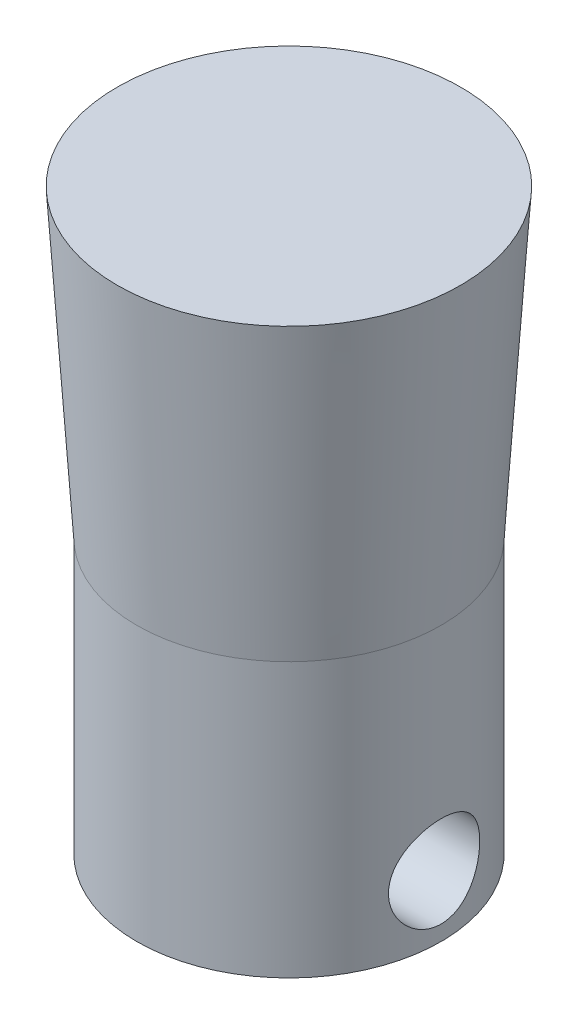
ISO-10303-21;
HEADER;
FILE_DESCRIPTION(('STEP AP214'),'2;1');
FILE_NAME('part.step','',(''),(''),'','','');
FILE_SCHEMA(('AUTOMOTIVE_DESIGN { 1 0 10303 214 1 1 1 1 }'));
ENDSEC;
DATA;
#1=APPLICATION_CONTEXT('core data for automotive mechanical design processes');
#2=APPLICATION_PROTOCOL_DEFINITION('international standard','automotive_design',2000,#1);
#3=PRODUCT_CONTEXT('',#1,'mechanical');
#4=PRODUCT('Part','Part','',(#3));
#5=PRODUCT_RELATED_PRODUCT_CATEGORY('part','',(#4));
#6=PRODUCT_DEFINITION_FORMATION('','',#4);
#7=PRODUCT_DEFINITION_CONTEXT('part definition',#1,'design');
#8=PRODUCT_DEFINITION('design','',#6,#7);
#9=PRODUCT_DEFINITION_SHAPE('','',#8);
#10=(LENGTH_UNIT() NAMED_UNIT(*) SI_UNIT(.MILLI.,.METRE.));
#11=(NAMED_UNIT(*) PLANE_ANGLE_UNIT() SI_UNIT($,.RADIAN.));
#12=(NAMED_UNIT(*) SI_UNIT($,.STERADIAN.) SOLID_ANGLE_UNIT());
#13=UNCERTAINTY_MEASURE_WITH_UNIT(LENGTH_MEASURE(1.E-05),#10,'distance_accuracy_value','');
#14=(GEOMETRIC_REPRESENTATION_CONTEXT(3) GLOBAL_UNCERTAINTY_ASSIGNED_CONTEXT((#13)) GLOBAL_UNIT_ASSIGNED_CONTEXT((#10,
#11,#12)) REPRESENTATION_CONTEXT('',''));
#15=CARTESIAN_POINT('',(0.,0.,0.));
#16=DIRECTION('',(0.,0.,1.));
#17=DIRECTION('',(1.,0.,0.));
#18=AXIS2_PLACEMENT_3D('',#15,#16,#17);
#19=CARTESIAN_POINT('',(0.,9.,0.));
#20=DIRECTION('',(0.,-1.,0.));
#21=DIRECTION('',(0.,0.,-1.));
#22=AXIS2_PLACEMENT_3D('',#19,#20,#21);
#23=CYLINDRICAL_SURFACE('',#22,5.);
#24=CARTESIAN_POINT('',(-5.,0.5,0.));
#25=CARTESIAN_POINT('',(-4.9999992925055,0.500000997484886,-0.0822886127533));
#26=CARTESIAN_POINT('',(-4.99794915693954,0.506793863623966,-0.164587318351529));
#27=CARTESIAN_POINT('',(-4.98997105593691,0.533721354222101,-0.326788125304881));
#28=CARTESIAN_POINT('',(-4.98404193389692,0.553859958023342,-0.40668950441142));
#29=CARTESIAN_POINT('',(-4.96895552501836,0.606746016910264,-0.561732707754527));
#30=CARTESIAN_POINT('',(-4.95980300250425,0.639474869618937,-0.636881364395373));
#31=CARTESIAN_POINT('',(-4.93922109237645,0.716536093055836,-0.780624181053131));
#32=CARTESIAN_POINT('',(-4.92779140192067,0.760870007395417,-0.84921746746967));
#33=CARTESIAN_POINT('',(-4.90350737192774,0.861224007472669,-0.979871797183745));
#34=CARTESIAN_POINT('',(-4.89062383657036,0.917516625885914,-1.04171807124434));
#35=CARTESIAN_POINT('',(-4.86505834210442,1.03960922991018,-1.15524920923324));
#36=CARTESIAN_POINT('',(-4.85237641724501,1.10541081212496,-1.20693236327441));
#37=CARTESIAN_POINT('',(-4.82834113993772,1.24647075303761,-1.29980037723708));
#38=CARTESIAN_POINT('',(-4.81702406663875,1.32190846099074,-1.34072309022213));
#39=CARTESIAN_POINT('',(-4.79743620394031,1.47898925423029,-1.4092139477476));
#40=CARTESIAN_POINT('',(-4.78916468313311,1.56063084392798,-1.43678529919973));
#41=CARTESIAN_POINT('',(-4.77690870838434,1.72539026613046,-1.47701633682652));
#42=CARTESIAN_POINT('',(-4.77281069324533,1.80840274386394,-1.49007196234677));
#43=CARTESIAN_POINT('',(-4.76902789749767,1.97553315621677,-1.50213730614672));
#44=CARTESIAN_POINT('',(-4.76934204760571,2.05965081805909,-1.50115042761078));
#45=CARTESIAN_POINT('',(-4.77424744067778,2.22338390860848,-1.48546977199812));
#46=CARTESIAN_POINT('',(-4.7786838859914,2.30305225036224,-1.47127205262685));
#47=CARTESIAN_POINT('',(-4.79108356228624,2.45881978627346,-1.43037420427056));
#48=CARTESIAN_POINT('',(-4.79904714132351,2.53491862737433,-1.40367284141641));
#49=CARTESIAN_POINT('',(-4.81772733074973,2.68260034966074,-1.33816026653682));
#50=CARTESIAN_POINT('',(-4.82848016115952,2.75410708395526,-1.29918816934642));
#51=CARTESIAN_POINT('',(-4.85150987000065,2.88973202201019,-1.21035222588683));
#52=CARTESIAN_POINT('',(-4.86378711746991,2.95384842941378,-1.16048574002588));
#53=CARTESIAN_POINT('',(-4.88911011297937,3.07568619076202,-1.04881290765546));
#54=CARTESIAN_POINT('',(-4.90216654310498,3.13302866402967,-0.986594907466972));
#55=CARTESIAN_POINT('',(-4.92712244063259,3.23655398406425,-0.853263259313967));
#56=CARTESIAN_POINT('',(-4.9390218351841,3.28273612841443,-0.782149051860888));
#57=CARTESIAN_POINT('',(-4.9604316006947,3.36285992246473,-0.632355038342803));
#58=CARTESIAN_POINT('',(-4.96992543668314,3.39671751624986,-0.55362774974795));
#59=CARTESIAN_POINT('',(-4.98533521832222,3.45059959009963,-0.39124541560352));
#60=CARTESIAN_POINT('',(-4.99125216186999,3.47062792853249,-0.307591751589582));
#61=CARTESIAN_POINT('',(-4.99868364643538,3.49565217789939,-0.140952242668332));
#62=CARTESIAN_POINT('',(-5.0003485041779,3.50116158580161,-0.0580500976011871));
#63=CARTESIAN_POINT('',(-4.9995292324176,3.49843084428792,0.107499605823383));
#64=CARTESIAN_POINT('',(-4.99704565677756,3.49019253034856,0.19014719669078));
#65=CARTESIAN_POINT('',(-4.98830696987163,3.4606153888885,0.350903605309697));
#66=CARTESIAN_POINT('',(-4.98213829799417,3.43957661241913,0.429072772614169));
#67=CARTESIAN_POINT('',(-4.96674347841533,3.3853567672218,0.580754638954522));
#68=CARTESIAN_POINT('',(-4.95751696321085,3.35217423896214,0.654266777025583));
#69=CARTESIAN_POINT('',(-4.93669654351325,3.27374683451887,0.796437189461052));
#70=CARTESIAN_POINT('',(-4.92505280829675,3.22824065905203,0.864943826199669));
#71=CARTESIAN_POINT('',(-4.90073468764318,3.12677524594719,0.993523307980147));
#72=CARTESIAN_POINT('',(-4.8880600443108,3.07081338811233,1.05359403235593));
#73=CARTESIAN_POINT('',(-4.86253171869138,2.94761269163066,1.16585744551027));
#74=CARTESIAN_POINT('',(-4.84968825033268,2.88003812422826,1.21768481231503));
#75=CARTESIAN_POINT('',(-4.82576515238464,2.73687206098647,1.30928995072154));
#76=CARTESIAN_POINT('',(-4.81468547654651,2.66128077544179,1.34906803829472));
#77=CARTESIAN_POINT('',(-4.79567189615055,2.50446750874531,1.41517347127168));
#78=CARTESIAN_POINT('',(-4.78772337843827,2.42327381346341,1.4415634693705));
#79=CARTESIAN_POINT('',(-4.77591594362794,2.25731203106852,1.48021730815114));
#80=CARTESIAN_POINT('',(-4.772055625083,2.17254517921233,1.49248598978779));
#81=CARTESIAN_POINT('',(-4.76899972496087,2.00563848162377,1.50221984485059));
#82=CARTESIAN_POINT('',(-4.76961647442754,1.92353634898242,1.5002805530849));
#83=CARTESIAN_POINT('',(-4.77499401288294,1.7608858966272,1.48307505444813));
#84=CARTESIAN_POINT('',(-4.77975463592551,1.68033751482365,1.46780938124716));
#85=CARTESIAN_POINT('',(-4.79275763670385,1.52405460085715,1.42476888804136));
#86=CARTESIAN_POINT('',(-4.80095604545965,1.44827271263831,1.39715175507068));
#87=CARTESIAN_POINT('',(-4.81990278909136,1.30235756118228,1.33031507121129));
#88=CARTESIAN_POINT('',(-4.83065161194312,1.23222538235924,1.29109329962876));
#89=CARTESIAN_POINT('',(-4.85397676425833,1.09683688347289,1.20048763805072));
#90=CARTESIAN_POINT('',(-4.86660540163798,1.03185123873959,1.14871276092994));
#91=CARTESIAN_POINT('',(-4.89201320450026,0.911297501692137,1.03517434629782));
#92=CARTESIAN_POINT('',(-4.90479240823905,0.855731860532243,0.973408217134502));
#93=CARTESIAN_POINT('',(-4.92950936570649,0.75397658770497,0.839465762183249));
#94=CARTESIAN_POINT('',(-4.94141159765674,0.708108553144511,0.767037885790608));
#95=CARTESIAN_POINT('',(-4.96260680455813,0.629264830095975,0.615141373983529));
#96=CARTESIAN_POINT('',(-4.97190099931067,0.596283111725492,0.535676052998955));
#97=CARTESIAN_POINT('',(-4.98602174969301,0.547104724347251,0.380757712655282));
#98=CARTESIAN_POINT('',(-4.99122027381068,0.529488327116752,0.305786961954234));
#99=CARTESIAN_POINT('',(-4.99820944494492,0.505936474758423,0.15388019523078));
#100=CARTESIAN_POINT('',(-5.0000006615474,0.499999067295181,0.0769445098581397));
#101=CARTESIAN_POINT('',(-5.,0.5,0.));
#102=B_SPLINE_CURVE_WITH_KNOTS('',3,(#24,#25,#26,#27,#28,#29,#30,#31,#32,#33,#34,#35,#36,#37,
#38,#39,#40,#41,#42,#43,#44,#45,#46,#47,#48,#49,#50,#51,#52,#53,#54,#55,#56,#57,#58,#59,#60,#61,
#62,#63,#64,#65,#66,#67,#68,#69,#70,#71,#72,#73,#74,#75,#76,#77,#78,#79,#80,#81,#82,#83,#84,#85,
#86,#87,#88,#89,#90,#91,#92,#93,#94,#95,#96,#97,#98,#99,#100,#101),.UNSPECIFIED.,.T.,.F.,(4,2,2,
2,2,2,2,2,2,2,2,2,2,2,2,2,2,2,2,2,2,2,2,2,2,2,2,2,2,2,2,2,2,2,2,2,2,2,4),(0.,0.246583203612611,
0.493239964846,0.739533676300874,0.985860164412702,1.23855602948191,1.49129437288633,
1.74971481004109,2.00807314543224,2.25919689356599,2.51025978319089,2.75226016697676,
2.99428443658001,3.23962426447119,3.48502360158555,3.74067104048166,3.99633456531071,
4.25371046881688,4.51101453528808,4.75908809438545,5.00712853550327,5.24956746682327,
5.49203554593728,5.74011305702908,5.98825282000191,6.24540400322818,6.5025484425268,
6.75847814951252,7.01432009460283,7.25950155466943,7.504673196616,7.74680040402721,
7.98897397553107,8.23996925679931,8.49102974897502,8.74942996156671,9.00770911595235,
9.23831691930459,9.46888616948874),.UNSPECIFIED.);
#103=CARTESIAN_POINT('',(-5.,0.5,0.));
#104=VERTEX_POINT('',#103);
#105=EDGE_CURVE('E11',#104,#104,#102,.T.);
#106=ORIENTED_EDGE('',*,*,#105,.T.);
#107=EDGE_LOOP('',(#106));
#108=FACE_BOUND('',#107,.T.);
#109=CARTESIAN_POINT('',(4.76969600708473,2.,-1.5));
#110=CARTESIAN_POINT('',(4.7696968572698,1.9178054520576,-1.49999897633764));
#111=CARTESIAN_POINT('',(4.77184390209069,1.83560077585598,-1.49322108167142));
#112=CARTESIAN_POINT('',(4.780165783029,1.67359475040806,-1.46635844446749));
#113=CARTESIAN_POINT('',(4.78634196493468,1.59379421349853,-1.44626925573578));
#114=CARTESIAN_POINT('',(4.80196102485632,1.43896527172827,-1.39352753269955));
#115=CARTESIAN_POINT('',(4.81139846703232,1.36392917036691,-1.36089589394243));
#116=CARTESIAN_POINT('',(4.83246932547567,1.2203780660047,-1.28406421917929));
#117=CARTESIAN_POINT('',(4.84410307041019,1.15186404131556,-1.23986245137053));
#118=CARTESIAN_POINT('',(4.86866862185765,1.02113360942262,-1.13964754141627));
#119=CARTESIAN_POINT('',(4.88162808311636,0.959154102053713,-1.08333207175807));
#120=CARTESIAN_POINT('',(4.90714861936757,0.845362048677491,-0.961136237579599));
#121=CARTESIAN_POINT('',(4.91970964297705,0.793550809550121,-0.895254645461111));
#122=CARTESIAN_POINT('',(4.94333214579389,0.700537300166693,-0.75411143779369));
#123=CARTESIAN_POINT('',(4.95435724342404,0.659576575557191,-0.678684021335815));
#124=CARTESIAN_POINT('',(4.97334435920684,0.591012740957243,-0.521624645369354));
#125=CARTESIAN_POINT('',(4.98130703789495,0.563406750142551,-0.439994028387912));
#126=CARTESIAN_POINT('',(4.99307646003589,0.523119998909491,-0.27532385263083));
#127=CARTESIAN_POINT('',(4.99699557369338,0.510034872347297,-0.192391398953801));
#128=CARTESIAN_POINT('',(5.00063201501348,0.497882675353559,-0.025421823749315));
#129=CARTESIAN_POINT('',(5.00035022521079,0.498812660598037,0.0586150620503682));
#130=CARTESIAN_POINT('',(4.99569603817659,0.514392868543023,0.22257115660016));
#131=CARTESIAN_POINT('',(4.9914542020526,0.528605193809869,0.302536267641341));
#132=CARTESIAN_POINT('',(4.97951522112593,0.56963133599429,0.458889213442527));
#133=CARTESIAN_POINT('',(4.97181785750586,0.596445950942671,0.535276821322846));
#134=CARTESIAN_POINT('',(4.95365220986963,0.662212023418558,0.683347326351281));
#135=CARTESIAN_POINT('',(4.94315269676706,0.701301202807267,0.754965064694478));
#136=CARTESIAN_POINT('',(4.92049640648069,0.790397852428228,0.890764673783156));
#137=CARTESIAN_POINT('',(4.90833923637778,0.840407912963484,0.954944774872131));
#138=CARTESIAN_POINT('',(4.88311550488165,0.952197750751597,1.0766604815298));
#139=CARTESIAN_POINT('',(4.87003195321461,1.01435691902974,1.13384458040111));
#140=CARTESIAN_POINT('',(4.84483979887497,1.14751001789005,1.23707651539824));
#141=CARTESIAN_POINT('',(4.8327312931702,1.21850482538923,1.28312324482853));
#142=CARTESIAN_POINT('',(4.81077903197678,1.36823946924899,1.3631399533545));
#143=CARTESIAN_POINT('',(4.80095810695957,1.44704704586292,1.39698989237679));
#144=CARTESIAN_POINT('',(4.78496392548436,1.60960720844554,1.45083362878413));
#145=CARTESIAN_POINT('',(4.7787894791583,1.69335817153456,1.4708319464056));
#146=CARTESIAN_POINT('',(4.77104849541241,1.86008236073928,1.49574770282165));
#147=CARTESIAN_POINT('',(4.7693187867044,1.94296822389398,1.50119946380212));
#148=CARTESIAN_POINT('',(4.77021192441924,2.10847290000987,1.49835947233062));
#149=CARTESIAN_POINT('',(4.77283416156589,2.19109174873085,1.4900696437133));
#150=CARTESIAN_POINT('',(4.78197558554912,2.35148837797087,1.4604576357419));
#151=CARTESIAN_POINT('',(4.78839176507489,2.42933616426352,1.4394796143128));
#152=CARTESIAN_POINT('',(4.80429141231227,2.58040169081492,1.3854857774794));
#153=CARTESIAN_POINT('',(4.81377535359073,2.65361871414057,1.3524681034276));
#154=CARTESIAN_POINT('',(4.83505835023047,2.79551746407213,1.274318711965));
#155=CARTESIAN_POINT('',(4.84691271069799,2.86402472098579,1.22888564172729));
#156=CARTESIAN_POINT('',(4.87148205646987,2.9926381061808,1.12755301600385));
#157=CARTESIAN_POINT('',(4.88419724730003,3.05274221761279,1.07165095534897));
#158=CARTESIAN_POINT('',(4.90963633548158,3.16518040581474,0.948455132493599));
#159=CARTESIAN_POINT('',(4.92234245063004,3.21713562898698,0.880811065857434));
#160=CARTESIAN_POINT('',(4.94584851748651,3.30896670102775,0.737461784590249));
#161=CARTESIAN_POINT('',(4.95664856384717,3.34884314978146,0.661756970543944));
#162=CARTESIAN_POINT('',(4.97505970474957,3.4150000305683,0.504935504705222));
#163=CARTESIAN_POINT('',(4.98269453424966,3.44138201615898,0.423864622037839));
#164=CARTESIAN_POINT('',(4.99401979596827,3.48006091889042,0.258169966504588));
#165=CARTESIAN_POINT('',(4.9977113567088,3.49236186594842,0.173547217354763));
#166=CARTESIAN_POINT('',(5.00066544081399,3.5022230440545,0.00665215388274265));
#167=CARTESIAN_POINT('',(5.00009305111322,3.50033269540783,-0.0755851790862068));
#168=CARTESIAN_POINT('',(4.99497264465037,3.48317836750088,-0.238519481164404));
#169=CARTESIAN_POINT('',(4.99042485330462,3.46791514651956,-0.319216537346529));
#170=CARTESIAN_POINT('',(4.97791168358327,3.42478833860038,-0.475935813041358));
#171=CARTESIAN_POINT('',(4.96998352900866,3.39706181935099,-0.551998927351392));
#172=CARTESIAN_POINT('',(4.9515294303945,3.32991808549281,-0.698433237752053));
#173=CARTESIAN_POINT('',(4.94100305949946,3.29049894971381,-0.76880349605058));
#174=CARTESIAN_POINT('',(4.91803965828228,3.19962654256996,-0.904301892420563));
#175=CARTESIAN_POINT('',(4.90555226923559,3.14782856999923,-0.969190250076767));
#176=CARTESIAN_POINT('',(4.88023537212334,3.0342896116672,-1.08953757134594));
#177=CARTESIAN_POINT('',(4.86740576641079,2.97254576210185,-1.14499380960194));
#178=CARTESIAN_POINT('',(4.84240680631319,2.83865922168949,-1.24656269394549));
#179=CARTESIAN_POINT('',(4.83026852693485,2.76626144660956,-1.29234759757956));
#180=CARTESIAN_POINT('',(4.80852547508793,2.61444482583898,-1.37104313528776));
#181=CARTESIAN_POINT('',(4.79891948596956,2.53502937639881,-1.40395995557289));
#182=CARTESIAN_POINT('',(4.78427816717594,2.38025956839373,-1.4530194253295));
#183=CARTESIAN_POINT('',(4.7788615484052,2.30539135306901,-1.47058859011232));
#184=CARTESIAN_POINT('',(4.77157042597167,2.15368477750423,-1.49407818835144));
#185=CARTESIAN_POINT('',(4.7696952122143,2.07684681535475,-1.50000095706095));
#186=CARTESIAN_POINT('',(4.76969600708473,2.,-1.5));
#187=B_SPLINE_CURVE_WITH_KNOTS('',3,(#109,#110,#111,#112,#113,#114,#115,#116,#117,#118,#119,
#120,#121,#122,#123,#124,#125,#126,#127,#128,#129,#130,#131,#132,#133,#134,#135,#136,#137,#138,
#139,#140,#141,#142,#143,#144,#145,#146,#147,#148,#149,#150,#151,#152,#153,#154,#155,#156,#157,
#158,#159,#160,#161,#162,#163,#164,#165,#166,#167,#168,#169,#170,#171,#172,#173,#174,#175,#176,
#177,#178,#179,#180,#181,#182,#183,#184,#185,#186),.UNSPECIFIED.,.T.,.F.,(4,2,2,2,2,2,2,2,2,2,2,
2,2,2,2,2,2,2,2,2,2,2,2,2,2,2,2,2,2,2,2,2,2,2,2,2,2,2,4),(0.,0.246300165915542,0.492682641689,
0.738656414466193,0.984667025370101,1.23773150007984,1.49082847871273,1.74915939273645,
2.00743455587877,2.25832140149558,2.5091555410144,2.7520012599088,2.99486235890376,
3.24055209335676,3.4863001659083,3.74152147023278,3.99676812491863,4.25446238246266,
4.51207250628411,4.76008080790309,5.00805439107388,5.24958594938817,5.49115481045787,
5.73920731809388,5.98731925928923,6.24479506100602,6.50225807324202,6.75775391814325,
7.01317662321682,7.2587630391122,7.50433553047755,7.74727096872219,7.99024634491378,
8.24099627054488,8.4918185262989,8.75011639669147,9.00828993963944,9.23861153857447,
9.4688869503356),.UNSPECIFIED.);
#188=CARTESIAN_POINT('',(4.76969600708473,2.,-1.5));
#189=VERTEX_POINT('',#188);
#190=EDGE_CURVE('E41',#189,#189,#187,.T.);
#191=ORIENTED_EDGE('',*,*,#190,.T.);
#192=EDGE_LOOP('',(#191));
#193=FACE_BOUND('',#192,.T.);
#194=CARTESIAN_POINT('',(0.,9.,0.));
#195=DIRECTION('',(0.,1.,0.));
#196=DIRECTION('',(0.,0.,1.));
#197=AXIS2_PLACEMENT_3D('',#194,#195,#196);
#198=CIRCLE('',#197,5.);
#199=CARTESIAN_POINT('',(0.,9.,5.));
#200=VERTEX_POINT('',#199);
#201=EDGE_CURVE('E46',#200,#200,#198,.T.);
#202=ORIENTED_EDGE('',*,*,#201,.F.);
#203=EDGE_LOOP('',(#202));
#204=FACE_BOUND('',#203,.T.);
#205=CARTESIAN_POINT('',(0.,0.,0.));
#206=DIRECTION('',(0.,1.,0.));
#207=DIRECTION('',(0.,0.,1.));
#208=AXIS2_PLACEMENT_3D('',#205,#206,#207);
#209=CIRCLE('',#208,5.);
#210=CARTESIAN_POINT('',(0.,0.,5.));
#211=VERTEX_POINT('',#210);
#212=EDGE_CURVE('E72',#211,#211,#209,.T.);
#213=ORIENTED_EDGE('',*,*,#212,.T.);
#214=EDGE_LOOP('',(#213));
#215=FACE_BOUND('',#214,.T.);
#216=ADVANCED_FACE('F33',(#108,#193,#204,#215),#23,.T.);
#217=CARTESIAN_POINT('',(0.,0.,0.));
#218=DIRECTION('',(0.,1.,0.));
#219=DIRECTION('',(0.,0.,1.));
#220=AXIS2_PLACEMENT_3D('',#217,#218,#219);
#221=PLANE('',#220);
#222=ORIENTED_EDGE('',*,*,#212,.F.);
#223=EDGE_LOOP('',(#222));
#224=FACE_BOUND('',#223,.T.);
#225=ADVANCED_FACE('F59',(#224),#221,.F.);
#226=CARTESIAN_POINT('',(-5.,2.,0.));
#227=DIRECTION('',(1.,0.,0.));
#228=DIRECTION('',(0.,0.,-1.));
#229=AXIS2_PLACEMENT_3D('',#226,#227,#228);
#230=CYLINDRICAL_SURFACE('',#229,1.5);
#231=ORIENTED_EDGE('',*,*,#190,.F.);
#232=EDGE_LOOP('',(#231));
#233=FACE_BOUND('',#232,.T.);
#234=ORIENTED_EDGE('',*,*,#105,.F.);
#235=EDGE_LOOP('',(#234));
#236=FACE_BOUND('',#235,.T.);
#237=ADVANCED_FACE('F54',(#233,#236),#230,.F.);
#238=CARTESIAN_POINT('',(0.,19.,0.));
#239=DIRECTION('',(0.,1.,0.));
#240=DIRECTION('',(0.,0.,1.));
#241=AXIS2_PLACEMENT_3D('',#238,#239,#240);
#242=PLANE('',#241);
#243=CARTESIAN_POINT('',(0.,19.,0.));
#244=DIRECTION('',(0.,1.,0.));
#245=DIRECTION('',(0.,0.,1.));
#246=AXIS2_PLACEMENT_3D('',#243,#244,#245);
#247=CIRCLE('',#246,5.642);
#248=CARTESIAN_POINT('',(0.,19.,5.642));
#249=VERTEX_POINT('',#248);
#250=EDGE_CURVE('E74',#249,#249,#247,.T.);
#251=ORIENTED_EDGE('',*,*,#250,.T.);
#252=EDGE_LOOP('',(#251));
#253=FACE_BOUND('',#252,.T.);
#254=ADVANCED_FACE('F58',(#253),#242,.T.);
#255=CARTESIAN_POINT('',(0.,9.,0.));
#256=DIRECTION('',(0.,1.,0.));
#257=DIRECTION('',(0.,0.,1.));
#258=AXIS2_PLACEMENT_3D('',#255,#256,#257);
#259=CONICAL_SURFACE('',#258,5.,0.0641120143887311);
#260=ORIENTED_EDGE('',*,*,#250,.F.);
#261=EDGE_LOOP('',(#260));
#262=FACE_BOUND('',#261,.T.);
#263=ORIENTED_EDGE('',*,*,#201,.T.);
#264=EDGE_LOOP('',(#263));
#265=FACE_BOUND('',#264,.T.);
#266=ADVANCED_FACE('F61',(#262,#265),#259,.T.);
#267=CLOSED_SHELL('',(#216,#225,#237,#254,#266));
#268=MANIFOLD_SOLID_BREP('B2',#267);
#269=ADVANCED_BREP_SHAPE_REPRESENTATION('',(#18,#268),#14);
#270=SHAPE_DEFINITION_REPRESENTATION(#9,#269);
ENDSEC;
END-ISO-10303-21;
